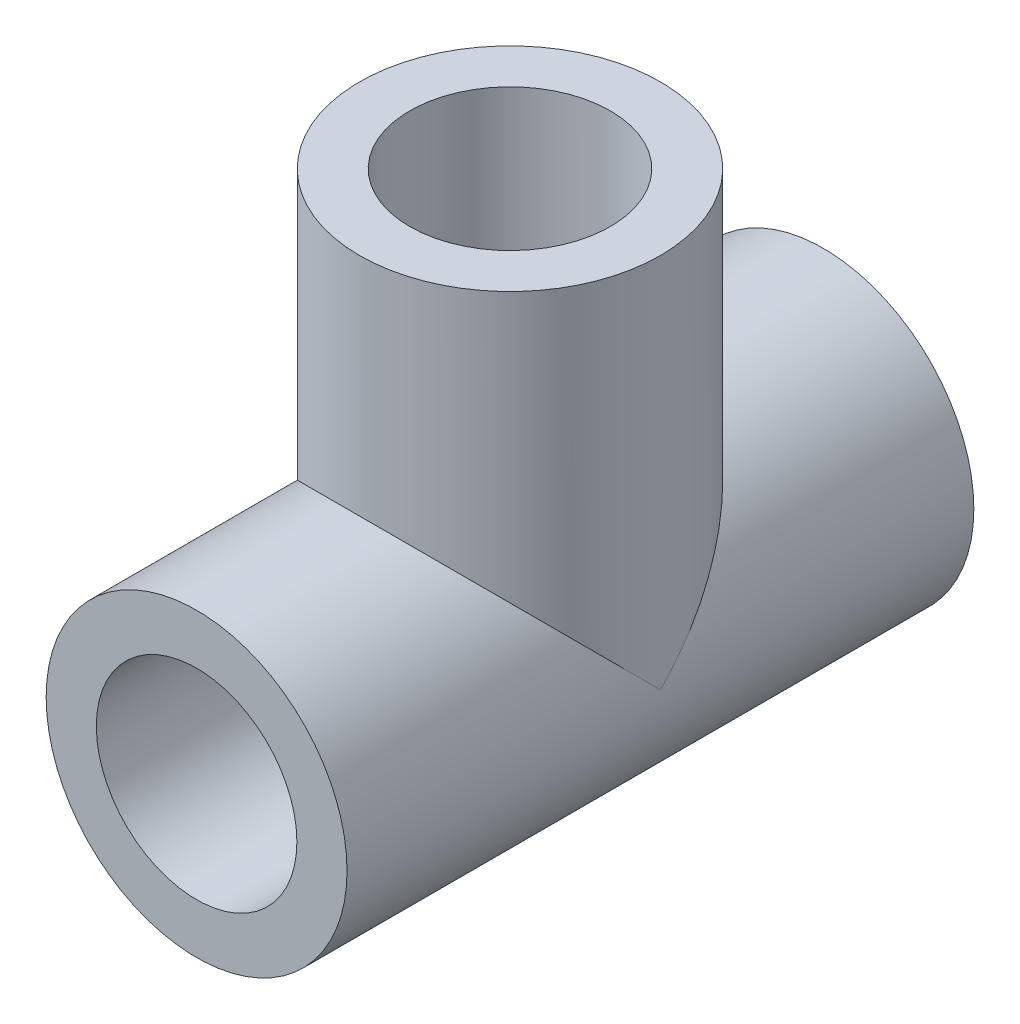
ISO-10303-21;
HEADER;
FILE_DESCRIPTION(('STEP AP214'),'2;1');
FILE_NAME('part.step','',(''),(''),'','','');
FILE_SCHEMA(('AUTOMOTIVE_DESIGN { 1 0 10303 214 1 1 1 1 }'));
ENDSEC;
DATA;
#1=APPLICATION_CONTEXT('core data for automotive mechanical design processes');
#2=APPLICATION_PROTOCOL_DEFINITION('international standard','automotive_design',2000,#1);
#3=PRODUCT_CONTEXT('',#1,'mechanical');
#4=PRODUCT('Part','Part','',(#3));
#5=PRODUCT_RELATED_PRODUCT_CATEGORY('part','',(#4));
#6=PRODUCT_DEFINITION_FORMATION('','',#4);
#7=PRODUCT_DEFINITION_CONTEXT('part definition',#1,'design');
#8=PRODUCT_DEFINITION('design','',#6,#7);
#9=PRODUCT_DEFINITION_SHAPE('','',#8);
#10=(LENGTH_UNIT() NAMED_UNIT(*) SI_UNIT(.MILLI.,.METRE.));
#11=(NAMED_UNIT(*) PLANE_ANGLE_UNIT() SI_UNIT($,.RADIAN.));
#12=(NAMED_UNIT(*) SI_UNIT($,.STERADIAN.) SOLID_ANGLE_UNIT());
#13=UNCERTAINTY_MEASURE_WITH_UNIT(LENGTH_MEASURE(1.E-05),#10,'distance_accuracy_value','');
#14=(GEOMETRIC_REPRESENTATION_CONTEXT(3) GLOBAL_UNCERTAINTY_ASSIGNED_CONTEXT((#13)) GLOBAL_UNIT_ASSIGNED_CONTEXT((#10,
#11,#12)) REPRESENTATION_CONTEXT('',''));
#15=CARTESIAN_POINT('',(0.,0.,0.));
#16=DIRECTION('',(0.,0.,1.));
#17=DIRECTION('',(1.,0.,0.));
#18=AXIS2_PLACEMENT_3D('',#15,#16,#17);
#19=CARTESIAN_POINT('',(0.,0.,12.5));
#20=DIRECTION('',(0.,0.,-1.));
#21=DIRECTION('',(-1.,0.,0.));
#22=AXIS2_PLACEMENT_3D('',#19,#20,#21);
#23=CYLINDRICAL_SURFACE('',#22,6.);
#24=CARTESIAN_POINT('',(0.,0.,-12.5));
#25=DIRECTION('',(0.,0.,1.));
#26=DIRECTION('',(1.,0.,0.));
#27=AXIS2_PLACEMENT_3D('',#24,#25,#26);
#28=CIRCLE('',#27,6.);
#29=CARTESIAN_POINT('',(6.,0.,-12.5));
#30=VERTEX_POINT('',#29);
#31=EDGE_CURVE('E46',#30,#30,#28,.T.);
#32=ORIENTED_EDGE('',*,*,#31,.T.);
#33=EDGE_LOOP('',(#32));
#34=FACE_BOUND('',#33,.T.);
#35=CARTESIAN_POINT('',(0.,0.,12.5));
#36=DIRECTION('',(0.,0.,1.));
#37=DIRECTION('',(1.,0.,0.));
#38=AXIS2_PLACEMENT_3D('',#35,#36,#37);
#39=CIRCLE('',#38,6.);
#40=CARTESIAN_POINT('',(6.,0.,12.5));
#41=VERTEX_POINT('',#40);
#42=EDGE_CURVE('E11',#41,#41,#39,.T.);
#43=ORIENTED_EDGE('',*,*,#42,.F.);
#44=EDGE_LOOP('',(#43));
#45=FACE_BOUND('',#44,.T.);
#46=CARTESIAN_POINT('',(0.,0.,0.));
#47=DIRECTION('',(0.,-0.707106781186547,-0.707106781186547));
#48=DIRECTION('',(0.,0.707106781186547,-0.707106781186547));
#49=AXIS2_PLACEMENT_3D('',#46,#47,#48);
#50=ELLIPSE('',#49,8.48528137423857,6.);
#51=CARTESIAN_POINT('',(6.,0.,0.));
#52=VERTEX_POINT('',#51);
#53=CARTESIAN_POINT('',(-6.,0.,0.));
#54=VERTEX_POINT('',#53);
#55=EDGE_CURVE('E58',#52,#54,#50,.F.);
#56=ORIENTED_EDGE('',*,*,#55,.F.);
#57=CARTESIAN_POINT('',(0.,0.,0.));
#58=DIRECTION('',(0.,0.707106781186547,-0.707106781186547));
#59=DIRECTION('',(0.,-0.707106781186547,-0.707106781186547));
#60=AXIS2_PLACEMENT_3D('',#57,#58,#59);
#61=ELLIPSE('',#60,8.48528137423857,6.);
#62=EDGE_CURVE('E56',#54,#52,#61,.T.);
#63=ORIENTED_EDGE('',*,*,#62,.F.);
#64=EDGE_LOOP('',(#56,#63));
#65=FACE_BOUND('',#64,.T.);
#66=ADVANCED_FACE('F41',(#34,#45,#65),#23,.T.);
#67=CARTESIAN_POINT('',(0.,0.,12.5));
#68=DIRECTION('',(0.,0.,1.));
#69=DIRECTION('',(1.,0.,0.));
#70=AXIS2_PLACEMENT_3D('',#67,#68,#69);
#71=PLANE('',#70);
#72=ORIENTED_EDGE('',*,*,#42,.T.);
#73=EDGE_LOOP('',(#72));
#74=FACE_BOUND('',#73,.T.);
#75=CARTESIAN_POINT('',(0.,0.,12.5));
#76=DIRECTION('',(0.,0.,1.));
#77=DIRECTION('',(1.,0.,0.));
#78=AXIS2_PLACEMENT_3D('',#75,#76,#77);
#79=CIRCLE('',#78,4.);
#80=CARTESIAN_POINT('',(4.,0.,12.5));
#81=VERTEX_POINT('',#80);
#82=EDGE_CURVE('E74',#81,#81,#79,.T.);
#83=ORIENTED_EDGE('',*,*,#82,.F.);
#84=EDGE_LOOP('',(#83));
#85=FACE_BOUND('',#84,.T.);
#86=ADVANCED_FACE('F94',(#74,#85),#71,.T.);
#87=CARTESIAN_POINT('',(0.,0.,-12.5));
#88=DIRECTION('',(0.,0.,1.));
#89=DIRECTION('',(1.,0.,0.));
#90=AXIS2_PLACEMENT_3D('',#87,#88,#89);
#91=PLANE('',#90);
#92=ORIENTED_EDGE('',*,*,#31,.F.);
#93=EDGE_LOOP('',(#92));
#94=FACE_BOUND('',#93,.T.);
#95=CARTESIAN_POINT('',(0.,0.,-12.5));
#96=DIRECTION('',(0.,0.,1.));
#97=DIRECTION('',(1.,0.,0.));
#98=AXIS2_PLACEMENT_3D('',#95,#96,#97);
#99=CIRCLE('',#98,4.);
#100=CARTESIAN_POINT('',(4.,0.,-12.5));
#101=VERTEX_POINT('',#100);
#102=EDGE_CURVE('E60',#101,#101,#99,.T.);
#103=ORIENTED_EDGE('',*,*,#102,.T.);
#104=EDGE_LOOP('',(#103));
#105=FACE_BOUND('',#104,.T.);
#106=ADVANCED_FACE('F80',(#94,#105),#91,.F.);
#107=CARTESIAN_POINT('',(0.,15.,0.));
#108=DIRECTION('',(0.,-1.,0.));
#109=DIRECTION('',(0.,0.,-1.));
#110=AXIS2_PLACEMENT_3D('',#107,#108,#109);
#111=CYLINDRICAL_SURFACE('',#110,6.);
#112=CARTESIAN_POINT('',(0.,15.,0.));
#113=DIRECTION('',(0.,1.,0.));
#114=DIRECTION('',(0.,0.,1.));
#115=AXIS2_PLACEMENT_3D('',#112,#113,#114);
#116=CIRCLE('',#115,6.);
#117=CARTESIAN_POINT('',(0.,15.,6.));
#118=VERTEX_POINT('',#117);
#119=EDGE_CURVE('E66',#118,#118,#116,.T.);
#120=ORIENTED_EDGE('',*,*,#119,.F.);
#121=EDGE_LOOP('',(#120));
#122=FACE_BOUND('',#121,.T.);
#123=ORIENTED_EDGE('',*,*,#62,.T.);
#124=ORIENTED_EDGE('',*,*,#55,.T.);
#125=EDGE_LOOP('',(#123,#124));
#126=FACE_BOUND('',#125,.T.);
#127=ADVANCED_FACE('F62',(#122,#126),#111,.T.);
#128=CARTESIAN_POINT('',(0.,15.,0.));
#129=DIRECTION('',(0.,-1.,0.));
#130=DIRECTION('',(0.,0.,-1.));
#131=AXIS2_PLACEMENT_3D('',#128,#129,#130);
#132=CYLINDRICAL_SURFACE('',#131,4.);
#133=CARTESIAN_POINT('',(0.,15.,0.));
#134=DIRECTION('',(0.,1.,0.));
#135=DIRECTION('',(0.,0.,1.));
#136=AXIS2_PLACEMENT_3D('',#133,#134,#135);
#137=CIRCLE('',#136,4.);
#138=CARTESIAN_POINT('',(0.,15.,4.));
#139=VERTEX_POINT('',#138);
#140=EDGE_CURVE('E128',#139,#139,#137,.T.);
#141=ORIENTED_EDGE('',*,*,#140,.T.);
#142=EDGE_LOOP('',(#141));
#143=FACE_BOUND('',#142,.T.);
#144=CARTESIAN_POINT('',(0.,6.,-4.));
#145=CARTESIAN_POINT('',(-0.200961877757264,5.9999978679194,-3.99999731509299));
#146=CARTESIAN_POINT('',(-0.401936080773152,5.9898153135426,-3.98477111179677));
#147=CARTESIAN_POINT('',(-0.79746821055015,5.95009379035347,-3.92480722053123));
#148=CARTESIAN_POINT('',(-0.992023045089949,5.92054563204443,-3.88005552185789));
#149=CARTESIAN_POINT('',(-1.36842380232543,5.84500964767637,-3.76378455728349));
#150=CARTESIAN_POINT('',(-1.55032457441004,5.79909884319835,-3.69239062773852));
#151=CARTESIAN_POINT('',(-1.89883175306967,5.69452202411023,-3.52587236557075));
#152=CARTESIAN_POINT('',(-2.06543593424075,5.63585415772491,-3.43074458752096));
#153=CARTESIAN_POINT('',(-2.3945652020353,5.50454977078536,-3.21069007401241));
#154=CARTESIAN_POINT('',(-2.55554447844211,5.43115036221204,-3.08391967515666));
#155=CARTESIAN_POINT('',(-2.85547224517316,5.27963383311262,-2.80852448379536));
#156=CARTESIAN_POINT('',(-2.994388569064,5.20151004959,-2.65986838038465));
#157=CARTESIAN_POINT('',(-3.19492879965059,5.07935723703535,-2.40961614455461));
#158=CARTESIAN_POINT('',(-3.26448421361659,5.03481061406829,-2.31452998061882));
#159=CARTESIAN_POINT('',(-3.39528506509656,4.9475474820456,-2.11801704850259));
#160=CARTESIAN_POINT('',(-3.45652861568795,4.90483139004999,-2.01658884818933));
#161=CARTESIAN_POINT('',(-3.62693348295432,4.78172496846676,-1.70342381658359));
#162=CARTESIAN_POINT('',(-3.72317686184202,4.70611539319262,-1.48230114462162));
#163=CARTESIAN_POINT('',(-3.85349251209103,4.59951859417335,-1.08655326709509));
#164=CARTESIAN_POINT('',(-3.89749210756546,4.56195075343585,-0.916936628689993));
#165=CARTESIAN_POINT('',(-3.96300919832951,4.5051611944835,-0.570517444896504));
#166=CARTESIAN_POINT('',(-3.98456544550022,4.48590785845124,-0.393727835129828));
#167=CARTESIAN_POINT('',(-4.0038281338153,4.46873162662322,-0.0370487026489548));
#168=CARTESIAN_POINT('',(-4.00143708609998,4.47089592105774,0.142850512567621));
#169=CARTESIAN_POINT('',(-3.97275139872465,4.49639563989106,0.499269480942148));
#170=CARTESIAN_POINT('',(-3.94643650788514,4.51974900048769,0.675786241624313));
#171=CARTESIAN_POINT('',(-3.8732999414292,4.58254368658664,1.01293421953745));
#172=CARTESIAN_POINT('',(-3.82743424461756,4.62122975554715,1.17392270387783));
#173=CARTESIAN_POINT('',(-3.71740235584691,4.71019246530652,1.48604735088561));
#174=CARTESIAN_POINT('',(-3.65323014197261,4.76047291902481,1.63718025143407));
#175=CARTESIAN_POINT('',(-3.49347638019648,4.87928392523269,1.95805080157593));
#176=CARTESIAN_POINT('',(-3.39416104750469,4.94944635418484,2.12531980389736));
#177=CARTESIAN_POINT('',(-3.17337920726676,5.09383075529723,2.4427667876367));
#178=CARTESIAN_POINT('',(-3.05188537955522,5.16805765436997,2.59292331466767));
#179=CARTESIAN_POINT('',(-2.75962330697744,5.33086687505155,2.90508509224792));
#180=CARTESIAN_POINT('',(-2.58387876581438,5.41909489435193,3.06266809764234));
#181=CARTESIAN_POINT('',(-2.20401599801903,5.58436201336345,3.34639298880042));
#182=CARTESIAN_POINT('',(-1.99992459865342,5.6614115529751,3.47256429075139));
#183=CARTESIAN_POINT('',(-1.60971565422037,5.78290808179582,3.66695543729926));
#184=CARTESIAN_POINT('',(-1.42791528675113,5.83078522330773,3.74168672669222));
#185=CARTESIAN_POINT('',(-1.05207208786365,5.91015438061304,3.86420985123641));
#186=CARTESIAN_POINT('',(-0.85803975800134,5.9416602425517,3.91202445426058));
#187=CARTESIAN_POINT('',(-0.461970906346526,5.98551764313533,3.97832233047986));
#188=CARTESIAN_POINT('',(-0.259903623868823,5.99778644922351,3.99667892187757));
#189=CARTESIAN_POINT('',(0.144883038779205,6.00166229930316,4.00249417712337));
#190=CARTESIAN_POINT('',(0.347602372373325,5.99327078771277,3.98995500097723));
#191=CARTESIAN_POINT('',(0.732911434408411,5.95799178848538,3.93675188887639));
#192=CARTESIAN_POINT('',(0.915914889358566,5.93244492780442,3.89812540448978));
#193=CARTESIAN_POINT('',(1.27223278485462,5.86636898569683,3.79680862797405));
#194=CARTESIAN_POINT('',(1.44554567514148,5.82583751494007,3.73411449814297));
#195=CARTESIAN_POINT('',(1.78932950093283,5.72992705058283,3.58269540591081));
#196=CARTESIAN_POINT('',(1.95899236926607,5.6737974027145,3.49262369183871));
#197=CARTESIAN_POINT('',(2.28136604791135,5.55203711223142,3.29113342010503));
#198=CARTESIAN_POINT('',(2.43406629638971,5.48640060808333,3.17970167892662));
#199=CARTESIAN_POINT('',(2.7437089096605,5.33909093306337,2.91878426369545));
#200=CARTESIAN_POINT('',(2.89750375144749,5.25652313598235,2.76606747989177));
#201=CARTESIAN_POINT('',(3.17867936133274,5.09142346174011,2.43777714004379));
#202=CARTESIAN_POINT('',(3.30604187293363,5.00889164843552,2.26218792162753));
#203=CARTESIAN_POINT('',(3.52249553117939,4.85879357933962,1.90571517460788));
#204=CARTESIAN_POINT('',(3.61391272319835,4.79055194025588,1.72653593359257));
#205=CARTESIAN_POINT('',(3.76992427411385,4.66877948558076,1.35225469459667));
#206=CARTESIAN_POINT('',(3.83456691107298,4.61522225155449,1.157182121472));
#207=CARTESIAN_POINT('',(3.9247168714152,4.53866416286692,0.790871027182808));
#208=CARTESIAN_POINT('',(3.95517195853461,4.51189995773817,0.621656385629329));
#209=CARTESIAN_POINT('',(3.99398411126519,4.477589331452,0.278853431987727));
#210=CARTESIAN_POINT('',(4.00236517901677,4.47002203690265,0.105270077800916));
#211=CARTESIAN_POINT('',(3.99647846633069,4.47528401304741,-0.241286093515516));
#212=CARTESIAN_POINT('',(3.98219727499794,4.48812536101584,-0.414258488378256));
#213=CARTESIAN_POINT('',(3.93193984471959,4.53220908525283,-0.754687131532796));
#214=CARTESIAN_POINT('',(3.89593466197412,4.56347600940483,-0.922135705736633));
#215=CARTESIAN_POINT('',(3.7918611850225,4.65053670224447,-1.29142202077443));
#216=CARTESIAN_POINT('',(3.71780572154623,4.71064593401662,-1.49053394888677));
#217=CARTESIAN_POINT('',(3.54168854300469,4.8444439609485,-1.87097514784974));
#218=CARTESIAN_POINT('',(3.43958750756441,4.91815177355726,-2.05227896329608));
#219=CARTESIAN_POINT('',(3.20797320614047,5.07234090111959,-2.39855810562116));
#220=CARTESIAN_POINT('',(3.07799480000577,5.15292108876611,-2.5631761432916));
#221=CARTESIAN_POINT('',(2.79340674971918,5.3125766931074,-2.87066631062144));
#222=CARTESIAN_POINT('',(2.63878955904372,5.39165164043383,-3.01353175145591));
#223=CARTESIAN_POINT('',(2.37780795718263,5.50971336238147,-3.21879506770052));
#224=CARTESIAN_POINT('',(2.27907205499529,5.55138661480074,-3.28948361559571));
#225=CARTESIAN_POINT('',(2.07453205585638,5.63101613508227,-3.42215785681578));
#226=CARTESIAN_POINT('',(1.96873124035978,5.66897410866294,-3.48414754958752));
#227=CARTESIAN_POINT('',(1.75068617470797,5.74005451433883,-3.59864385799369));
#228=CARTESIAN_POINT('',(1.63844803554365,5.77318143009499,-3.65115927748835));
#229=CARTESIAN_POINT('',(1.40828926088829,5.83360071790147,-3.74596123220397));
#230=CARTESIAN_POINT('',(1.29037063843991,5.86089513849429,-3.78825135953451));
#231=CARTESIAN_POINT('',(0.98297372434935,5.92199193347713,-3.88225688274283));
#232=CARTESIAN_POINT('',(0.79005240998176,5.95101863539404,-3.92620807661585));
#233=CARTESIAN_POINT('',(0.39808828546099,5.99001656656924,-3.98507005612642));
#234=CARTESIAN_POINT('',(0.199050188671043,6.00000211179877,-4.0000026593663));
#235=CARTESIAN_POINT('',(0.,6.,-4.));
#236=B_SPLINE_CURVE_WITH_KNOTS('',3,(#144,#145,#146,#147,#148,#149,#150,#151,#152,#153,#154,
#155,#156,#157,#158,#159,#160,#161,#162,#163,#164,#165,#166,#167,#168,#169,#170,#171,#172,#173,
#174,#175,#176,#177,#178,#179,#180,#181,#182,#183,#184,#185,#186,#187,#188,#189,#190,#191,#192,
#193,#194,#195,#196,#197,#198,#199,#200,#201,#202,#203,#204,#205,#206,#207,#208,#209,#210,#211,
#212,#213,#214,#215,#216,#217,#218,#219,#220,#221,#222,#223,#224,#225,#226,#227,#228,#229,#230,
#231,#232,#233,#234,#235),.UNSPECIFIED.,.T.,.F.,(4,2,2,2,2,2,2,2,2,2,2,2,2,2,2,2,2,2,2,2,2,2,2,
2,2,2,2,2,2,2,2,2,2,2,2,2,2,2,2,2,2,2,2,2,2,4),(0.,0.602106453010799,1.20449882869738,
1.80409230638046,2.40377287734773,3.05434058001113,3.70584823208637,4.08328599770793,
4.46080930477325,5.21378174776238,5.74934951237418,6.28399099576978,6.82080987356116,
7.35808358412064,7.87165288288697,8.38539131508566,9.00362713220156,9.62262971458523,
10.3750547289191,11.1267724450113,11.7311573929193,12.3350303418404,12.9414933048691,
13.5479138696524,14.1117373348335,14.6756507417495,15.2737225755744,15.8721647378882,
16.5652391618099,17.2587907024992,17.8936743450736,18.5274081717985,19.0471565993068,
19.5663396456459,20.085830044675,20.6060141160321,21.2648078130679,21.9245299065431,
22.5962605430738,23.2681973183871,23.6528866112052,24.0373984529808,24.4215511301868,
24.8055686591805,25.4023963552989,25.9987751531553),.UNSPECIFIED.);
#237=CARTESIAN_POINT('',(0.,6.,-4.));
#238=VERTEX_POINT('',#237);
#239=EDGE_CURVE('E63',#238,#238,#236,.T.);
#240=ORIENTED_EDGE('',*,*,#239,.F.);
#241=EDGE_LOOP('',(#240));
#242=FACE_BOUND('',#241,.T.);
#243=ADVANCED_FACE('F111',(#143,#242),#132,.F.);
#244=CARTESIAN_POINT('',(0.,15.,0.));
#245=DIRECTION('',(0.,1.,0.));
#246=DIRECTION('',(0.,0.,1.));
#247=AXIS2_PLACEMENT_3D('',#244,#245,#246);
#248=PLANE('',#247);
#249=ORIENTED_EDGE('',*,*,#119,.T.);
#250=EDGE_LOOP('',(#249));
#251=FACE_BOUND('',#250,.T.);
#252=ORIENTED_EDGE('',*,*,#140,.F.);
#253=EDGE_LOOP('',(#252));
#254=FACE_BOUND('',#253,.T.);
#255=ADVANCED_FACE('F89',(#251,#254),#248,.T.);
#256=ORIENTED_EDGE('',*,*,#239,.T.);
#257=EDGE_LOOP('',(#256));
#258=FACE_BOUND('',#257,.T.);
#259=ADVANCED_FACE('F43',(#258),#23,.T.);
#260=CARTESIAN_POINT('',(0.,0.,12.5));
#261=DIRECTION('',(0.,0.,-1.));
#262=DIRECTION('',(-1.,0.,0.));
#263=AXIS2_PLACEMENT_3D('',#260,#261,#262);
#264=CYLINDRICAL_SURFACE('',#263,4.);
#265=ORIENTED_EDGE('',*,*,#82,.T.);
#266=EDGE_LOOP('',(#265));
#267=FACE_BOUND('',#266,.T.);
#268=ORIENTED_EDGE('',*,*,#102,.F.);
#269=EDGE_LOOP('',(#268));
#270=FACE_BOUND('',#269,.T.);
#271=ADVANCED_FACE('F82',(#267,#270),#264,.F.);
#272=CLOSED_SHELL('',(#66,#86,#106,#127,#243,#255,#259,#271));
#273=MANIFOLD_SOLID_BREP('B2',#272);
#274=ADVANCED_BREP_SHAPE_REPRESENTATION('',(#18,#273),#14);
#275=SHAPE_DEFINITION_REPRESENTATION(#9,#274);
ENDSEC;
END-ISO-10303-21;
